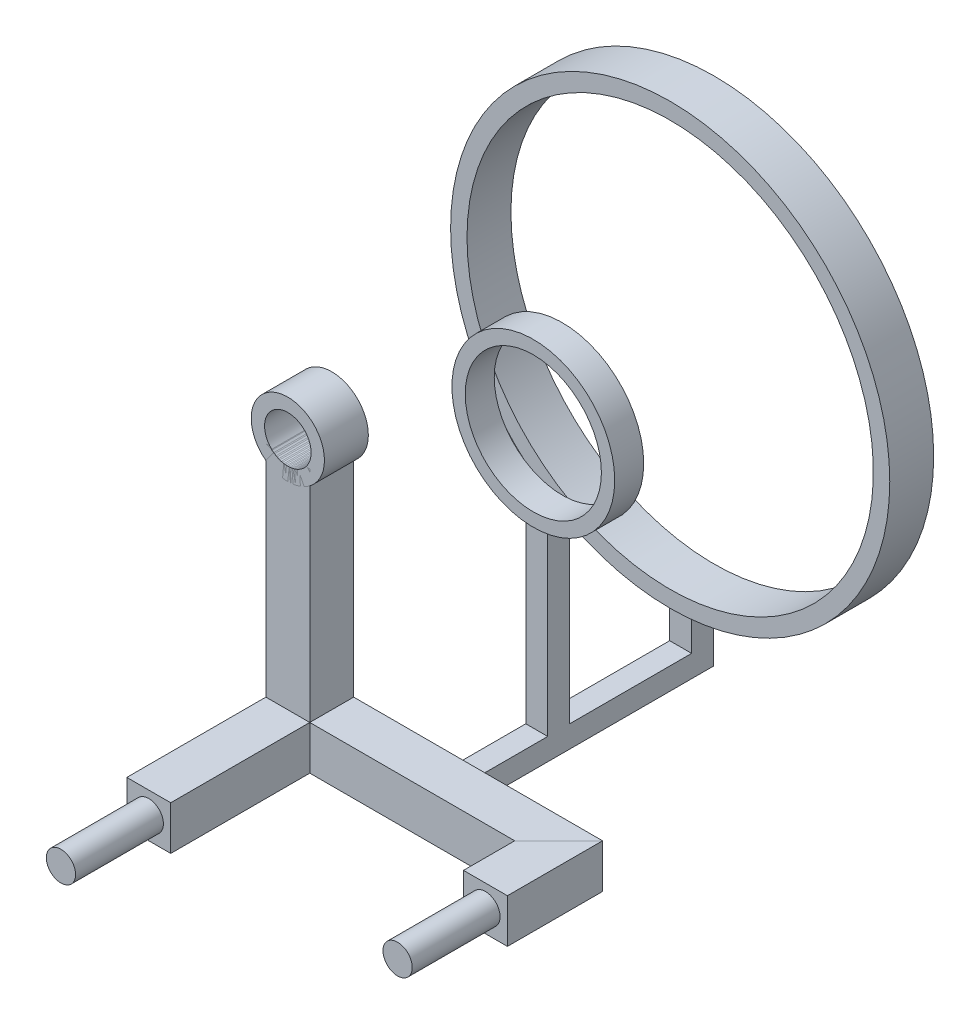
ISO-10303-21;
HEADER;
FILE_DESCRIPTION(('STEP AP214'),'2;1');
FILE_NAME('part.step','',(''),(''),'','','');
FILE_SCHEMA(('AUTOMOTIVE_DESIGN { 1 0 10303 214 1 1 1 1 }'));
ENDSEC;
DATA;
#1=APPLICATION_CONTEXT('core data for automotive mechanical design processes');
#2=APPLICATION_PROTOCOL_DEFINITION('international standard','automotive_design',2000,#1);
#3=PRODUCT_CONTEXT('',#1,'mechanical');
#4=PRODUCT('Part','Part','',(#3));
#5=PRODUCT_RELATED_PRODUCT_CATEGORY('part','',(#4));
#6=PRODUCT_DEFINITION_FORMATION('','',#4);
#7=PRODUCT_DEFINITION_CONTEXT('part definition',#1,'design');
#8=PRODUCT_DEFINITION('design','',#6,#7);
#9=PRODUCT_DEFINITION_SHAPE('','',#8);
#10=(LENGTH_UNIT() NAMED_UNIT(*) SI_UNIT(.MILLI.,.METRE.));
#11=(NAMED_UNIT(*) PLANE_ANGLE_UNIT() SI_UNIT($,.RADIAN.));
#12=(NAMED_UNIT(*) SI_UNIT($,.STERADIAN.) SOLID_ANGLE_UNIT());
#13=UNCERTAINTY_MEASURE_WITH_UNIT(LENGTH_MEASURE(1.E-05),#10,'distance_accuracy_value','');
#14=(GEOMETRIC_REPRESENTATION_CONTEXT(3) GLOBAL_UNCERTAINTY_ASSIGNED_CONTEXT((#13)) GLOBAL_UNIT_ASSIGNED_CONTEXT((#10,
#11,#12)) REPRESENTATION_CONTEXT('',''));
#15=CARTESIAN_POINT('',(0.,0.,0.));
#16=DIRECTION('',(0.,0.,1.));
#17=DIRECTION('',(1.,0.,0.));
#18=AXIS2_PLACEMENT_3D('',#15,#16,#17);
#19=CARTESIAN_POINT('',(8.95579673157945,0.,-19.8));
#20=DIRECTION('',(1.,0.,0.));
#21=DIRECTION('',(0.,0.,-1.));
#22=AXIS2_PLACEMENT_3D('',#19,#20,#21);
#23=PLANE('',#22);
#24=DIRECTION('',(0.,-1.,0.));
#25=VECTOR('',#24,1.);
#26=CARTESIAN_POINT('',(8.95579673157945,-1.5,-29.63));
#27=LINE('',#26,#25);
#28=CARTESIAN_POINT('',(8.95579673157945,2.69708856600093,-29.63));
#29=VERTEX_POINT('',#28);
#30=CARTESIAN_POINT('',(8.95579673157945,-1.5,-29.63));
#31=VERTEX_POINT('',#30);
#32=EDGE_CURVE('E139',#29,#31,#27,.T.);
#33=ORIENTED_EDGE('',*,*,#32,.F.);
#34=DIRECTION('',(0.,0.,1.));
#35=VECTOR('',#34,1.);
#36=CARTESIAN_POINT('',(8.95579673157945,2.69708856600093,-30.38));
#37=LINE('',#36,#35);
#38=CARTESIAN_POINT('',(8.95579673157945,2.69708856600093,-28.13));
#39=VERTEX_POINT('',#38);
#40=EDGE_CURVE('E137',#29,#39,#37,.T.);
#41=ORIENTED_EDGE('',*,*,#40,.T.);
#42=DIRECTION('',(0.,-1.,0.));
#43=VECTOR('',#42,1.);
#44=CARTESIAN_POINT('',(8.95579673157945,3.,-28.13));
#45=LINE('',#44,#43);
#46=CARTESIAN_POINT('',(8.95579673157945,0.,-28.13));
#47=VERTEX_POINT('',#46);
#48=EDGE_CURVE('E127',#39,#47,#45,.T.);
#49=ORIENTED_EDGE('',*,*,#48,.T.);
#50=DIRECTION('',(0.,0.,1.));
#51=VECTOR('',#50,1.);
#52=CARTESIAN_POINT('',(8.95579673157945,0.,-29.63));
#53=LINE('',#52,#51);
#54=CARTESIAN_POINT('',(8.95579673157945,0.,-19.8));
#55=VERTEX_POINT('',#54);
#56=EDGE_CURVE('E160',#47,#55,#53,.T.);
#57=ORIENTED_EDGE('',*,*,#56,.T.);
#58=DIRECTION('',(0.,1.,0.));
#59=VECTOR('',#58,1.);
#60=CARTESIAN_POINT('',(8.95579673157945,0.,-19.8));
#61=LINE('',#60,#59);
#62=CARTESIAN_POINT('',(8.95579673157945,12.1701638778981,-19.8));
#63=VERTEX_POINT('',#62);
#64=EDGE_CURVE('E194',#55,#63,#61,.T.);
#65=ORIENTED_EDGE('',*,*,#64,.T.);
#66=DIRECTION('',(0.,0.,-1.));
#67=VECTOR('',#66,1.);
#68=CARTESIAN_POINT('',(8.95579673157945,12.1701638778981,-18.06));
#69=LINE('',#68,#67);
#70=CARTESIAN_POINT('',(8.95579673157945,12.1701638778981,-18.3));
#71=VERTEX_POINT('',#70);
#72=EDGE_CURVE('E180',#63,#71,#69,.F.);
#73=ORIENTED_EDGE('',*,*,#72,.T.);
#74=DIRECTION('',(0.,-1.,0.));
#75=VECTOR('',#74,1.);
#76=CARTESIAN_POINT('',(8.95579673157945,17.68,-18.3));
#77=LINE('',#76,#75);
#78=CARTESIAN_POINT('',(8.95579673157945,0.,-18.3));
#79=VERTEX_POINT('',#78);
#80=EDGE_CURVE('E189',#71,#79,#77,.T.);
#81=ORIENTED_EDGE('',*,*,#80,.T.);
#82=DIRECTION('',(0.,0.,1.));
#83=VECTOR('',#82,1.);
#84=CARTESIAN_POINT('',(8.95579673157945,0.,-19.8));
#85=LINE('',#84,#83);
#86=CARTESIAN_POINT('',(8.95579673157945,0.,-11.75));
#87=VERTEX_POINT('',#86);
#88=EDGE_CURVE('E200',#79,#87,#85,.T.);
#89=ORIENTED_EDGE('',*,*,#88,.T.);
#90=DIRECTION('',(0.,1.,0.));
#91=VECTOR('',#90,1.);
#92=CARTESIAN_POINT('',(8.95579673157945,0.,-11.75));
#93=LINE('',#92,#91);
#94=CARTESIAN_POINT('',(8.95579673157945,-1.5,-11.75));
#95=VERTEX_POINT('',#94);
#96=EDGE_CURVE('E193',#95,#87,#93,.T.);
#97=ORIENTED_EDGE('',*,*,#96,.F.);
#98=DIRECTION('',(0.,0.,1.));
#99=VECTOR('',#98,1.);
#100=CARTESIAN_POINT('',(8.95579673157945,-1.5,-19.8));
#101=LINE('',#100,#99);
#102=EDGE_CURVE('E211',#31,#95,#101,.T.);
#103=ORIENTED_EDGE('',*,*,#102,.F.);
#104=EDGE_LOOP('',(#33,#41,#49,#57,#65,#73,#81,#89,#97,#103));
#105=FACE_BOUND('',#104,.T.);
#106=ADVANCED_FACE('F50',(#105),#23,.T.);
#107=CARTESIAN_POINT('',(7.45579673157945,0.,-19.8));
#108=DIRECTION('',(-1.,0.,0.));
#109=DIRECTION('',(0.,0.,1.));
#110=AXIS2_PLACEMENT_3D('',#107,#108,#109);
#111=PLANE('',#110);
#112=DIRECTION('',(0.,-1.,0.));
#113=VECTOR('',#112,1.);
#114=CARTESIAN_POINT('',(7.45579673157945,3.,-28.13));
#115=LINE('',#114,#113);
#116=CARTESIAN_POINT('',(7.45579673157945,2.70051318523233,-28.13));
#117=VERTEX_POINT('',#116);
#118=CARTESIAN_POINT('',(7.45579673157945,0.,-28.13));
#119=VERTEX_POINT('',#118);
#120=EDGE_CURVE('E134',#117,#119,#115,.T.);
#121=ORIENTED_EDGE('',*,*,#120,.F.);
#122=DIRECTION('',(0.,0.,1.));
#123=VECTOR('',#122,1.);
#124=CARTESIAN_POINT('',(7.45579673157945,2.70051318523233,-30.38));
#125=LINE('',#124,#123);
#126=CARTESIAN_POINT('',(7.45579673157945,2.70051318523233,-29.63));
#127=VERTEX_POINT('',#126);
#128=EDGE_CURVE('E64',#117,#127,#125,.F.);
#129=ORIENTED_EDGE('',*,*,#128,.T.);
#130=DIRECTION('',(0.,1.,0.));
#131=VECTOR('',#130,1.);
#132=CARTESIAN_POINT('',(7.45579673157945,-1.5,-29.63));
#133=LINE('',#132,#131);
#134=CARTESIAN_POINT('',(7.45579673157945,-1.5,-29.63));
#135=VERTEX_POINT('',#134);
#136=EDGE_CURVE('E158',#135,#127,#133,.T.);
#137=ORIENTED_EDGE('',*,*,#136,.F.);
#138=DIRECTION('',(0.,0.,1.));
#139=VECTOR('',#138,1.);
#140=CARTESIAN_POINT('',(7.45579673157945,-1.5,-19.8));
#141=LINE('',#140,#139);
#142=CARTESIAN_POINT('',(7.45579673157945,-1.5,-11.75));
#143=VERTEX_POINT('',#142);
#144=EDGE_CURVE('E213',#135,#143,#141,.T.);
#145=ORIENTED_EDGE('',*,*,#144,.T.);
#146=DIRECTION('',(0.,-1.,0.));
#147=VECTOR('',#146,1.);
#148=CARTESIAN_POINT('',(7.45579673157945,0.,-11.75));
#149=LINE('',#148,#147);
#150=CARTESIAN_POINT('',(7.45579673157945,0.,-11.75));
#151=VERTEX_POINT('',#150);
#152=EDGE_CURVE('E206',#151,#143,#149,.T.);
#153=ORIENTED_EDGE('',*,*,#152,.F.);
#154=DIRECTION('',(0.,0.,1.));
#155=VECTOR('',#154,1.);
#156=CARTESIAN_POINT('',(7.45579673157945,0.,-19.8));
#157=LINE('',#156,#155);
#158=CARTESIAN_POINT('',(7.45579673157945,0.,-18.3));
#159=VERTEX_POINT('',#158);
#160=EDGE_CURVE('E215',#159,#151,#157,.T.);
#161=ORIENTED_EDGE('',*,*,#160,.F.);
#162=DIRECTION('',(0.,-1.,0.));
#163=VECTOR('',#162,1.);
#164=CARTESIAN_POINT('',(7.45579673157945,17.68,-18.3));
#165=LINE('',#164,#163);
#166=CARTESIAN_POINT('',(7.45579673157945,12.1714726016647,-18.3));
#167=VERTEX_POINT('',#166);
#168=EDGE_CURVE('E191',#167,#159,#165,.T.);
#169=ORIENTED_EDGE('',*,*,#168,.F.);
#170=DIRECTION('',(0.,0.,-1.));
#171=VECTOR('',#170,1.);
#172=CARTESIAN_POINT('',(7.45579673157945,12.1714726016647,-18.06));
#173=LINE('',#172,#171);
#174=CARTESIAN_POINT('',(7.45579673157945,12.1714726016647,-19.8));
#175=VERTEX_POINT('',#174);
#176=EDGE_CURVE('E176',#167,#175,#173,.T.);
#177=ORIENTED_EDGE('',*,*,#176,.T.);
#178=DIRECTION('',(0.,-1.,0.));
#179=VECTOR('',#178,1.);
#180=CARTESIAN_POINT('',(7.45579673157945,0.,-19.8));
#181=LINE('',#180,#179);
#182=CARTESIAN_POINT('',(7.45579673157945,0.,-19.8));
#183=VERTEX_POINT('',#182);
#184=EDGE_CURVE('E196',#175,#183,#181,.T.);
#185=ORIENTED_EDGE('',*,*,#184,.T.);
#186=DIRECTION('',(0.,0.,1.));
#187=VECTOR('',#186,1.);
#188=CARTESIAN_POINT('',(7.45579673157945,0.,-29.63));
#189=LINE('',#188,#187);
#190=EDGE_CURVE('E164',#119,#183,#189,.T.);
#191=ORIENTED_EDGE('',*,*,#190,.F.);
#192=EDGE_LOOP('',(#121,#129,#137,#145,#153,#161,#169,#177,#185,#191));
#193=FACE_BOUND('',#192,.T.);
#194=ADVANCED_FACE('F227',(#193),#111,.T.);
#195=CARTESIAN_POINT('',(8.95579673157945,0.,-29.63));
#196=DIRECTION('',(0.,-1.,0.));
#197=DIRECTION('',(0.,0.,-1.));
#198=AXIS2_PLACEMENT_3D('',#195,#196,#197);
#199=PLANE('',#198);
#200=DIRECTION('',(1.,0.,0.));
#201=VECTOR('',#200,1.);
#202=CARTESIAN_POINT('',(7.45579673157945,0.,-28.13));
#203=LINE('',#202,#201);
#204=EDGE_CURVE('E131',#119,#47,#203,.T.);
#205=ORIENTED_EDGE('',*,*,#204,.F.);
#206=ORIENTED_EDGE('',*,*,#190,.T.);
#207=DIRECTION('',(1.,0.,0.));
#208=VECTOR('',#207,1.);
#209=CARTESIAN_POINT('',(8.95579673157945,0.,-19.8));
#210=LINE('',#209,#208);
#211=EDGE_CURVE('E153',#183,#55,#210,.T.);
#212=ORIENTED_EDGE('',*,*,#211,.T.);
#213=ORIENTED_EDGE('',*,*,#56,.F.);
#214=EDGE_LOOP('',(#205,#206,#212,#213));
#215=FACE_BOUND('',#214,.T.);
#216=ADVANCED_FACE('F242',(#215),#199,.F.);
#217=CARTESIAN_POINT('',(0.,0.,-19.8));
#218=DIRECTION('',(0.,0.,1.));
#219=DIRECTION('',(1.,0.,0.));
#220=AXIS2_PLACEMENT_3D('',#217,#218,#219);
#221=PLANE('',#220);
#222=ORIENTED_EDGE('',*,*,#211,.F.);
#223=ORIENTED_EDGE('',*,*,#184,.F.);
#224=CARTESIAN_POINT('',(8.21060339574557,17.6799993466058,-19.8));
#225=DIRECTION('',(0.,0.,1.));
#226=DIRECTION('',(1.,0.,0.));
#227=AXIS2_PLACEMENT_3D('',#224,#225,#226);
#228=CIRCLE('',#227,5.56);
#229=EDGE_CURVE('E183',#63,#175,#228,.F.);
#230=ORIENTED_EDGE('',*,*,#229,.F.);
#231=ORIENTED_EDGE('',*,*,#64,.F.);
#232=EDGE_LOOP('',(#222,#223,#230,#231));
#233=FACE_BOUND('',#232,.T.);
#234=ADVANCED_FACE('F239',(#233),#221,.F.);
#235=CARTESIAN_POINT('',(7.45579673157945,-1.5,-19.8));
#236=DIRECTION('',(0.,-1.,0.));
#237=DIRECTION('',(0.,0.,-1.));
#238=AXIS2_PLACEMENT_3D('',#235,#236,#237);
#239=PLANE('',#238);
#240=DIRECTION('',(1.,0.,0.));
#241=VECTOR('',#240,1.);
#242=CARTESIAN_POINT('',(7.45579673157945,-1.5,-11.75));
#243=LINE('',#242,#241);
#244=EDGE_CURVE('E197',#143,#95,#243,.T.);
#245=ORIENTED_EDGE('',*,*,#244,.F.);
#246=ORIENTED_EDGE('',*,*,#144,.F.);
#247=DIRECTION('',(-1.,0.,0.));
#248=VECTOR('',#247,1.);
#249=CARTESIAN_POINT('',(8.95579673157945,-1.5,-29.63));
#250=LINE('',#249,#248);
#251=EDGE_CURVE('E155',#31,#135,#250,.T.);
#252=ORIENTED_EDGE('',*,*,#251,.F.);
#253=ORIENTED_EDGE('',*,*,#102,.T.);
#254=EDGE_LOOP('',(#245,#246,#252,#253));
#255=FACE_BOUND('',#254,.T.);
#256=ADVANCED_FACE('F249',(#255),#239,.T.);
#257=CARTESIAN_POINT('',(7.45579673157945,0.,-19.8));
#258=DIRECTION('',(0.,1.,0.));
#259=DIRECTION('',(0.,0.,1.));
#260=AXIS2_PLACEMENT_3D('',#257,#258,#259);
#261=PLANE('',#260);
#262=DIRECTION('',(1.,0.,0.));
#263=VECTOR('',#262,1.);
#264=CARTESIAN_POINT('',(7.45579673157945,0.,-18.3));
#265=LINE('',#264,#263);
#266=EDGE_CURVE('E186',#159,#79,#265,.T.);
#267=ORIENTED_EDGE('',*,*,#266,.F.);
#268=ORIENTED_EDGE('',*,*,#160,.T.);
#269=DIRECTION('',(-1.,0.,0.));
#270=VECTOR('',#269,1.);
#271=CARTESIAN_POINT('',(7.45579673157945,0.,-11.75));
#272=LINE('',#271,#270);
#273=EDGE_CURVE('E203',#87,#151,#272,.T.);
#274=ORIENTED_EDGE('',*,*,#273,.F.);
#275=ORIENTED_EDGE('',*,*,#88,.F.);
#276=EDGE_LOOP('',(#267,#268,#274,#275));
#277=FACE_BOUND('',#276,.T.);
#278=ADVANCED_FACE('F232',(#277),#261,.T.);
#279=CARTESIAN_POINT('',(0.,0.,-11.75));
#280=DIRECTION('',(0.,0.,1.));
#281=DIRECTION('',(1.,0.,0.));
#282=AXIS2_PLACEMENT_3D('',#279,#280,#281);
#283=PLANE('',#282);
#284=ORIENTED_EDGE('',*,*,#96,.T.);
#285=ORIENTED_EDGE('',*,*,#273,.T.);
#286=ORIENTED_EDGE('',*,*,#152,.T.);
#287=ORIENTED_EDGE('',*,*,#244,.T.);
#288=EDGE_LOOP('',(#284,#285,#286,#287));
#289=FACE_BOUND('',#288,.T.);
#290=ADVANCED_FACE('F433',(#289),#283,.T.);
#291=CARTESIAN_POINT('',(7.45579673157945,17.68,-18.3));
#292=DIRECTION('',(0.,0.,-1.));
#293=DIRECTION('',(-1.,0.,0.));
#294=AXIS2_PLACEMENT_3D('',#291,#292,#293);
#295=PLANE('',#294);
#296=CARTESIAN_POINT('',(8.21060339574557,17.6799993466058,-18.3));
#297=DIRECTION('',(0.,0.,-1.));
#298=DIRECTION('',(-1.,0.,0.));
#299=AXIS2_PLACEMENT_3D('',#296,#297,#298);
#300=CIRCLE('',#299,5.56);
#301=EDGE_CURVE('E57',#167,#71,#300,.F.);
#302=ORIENTED_EDGE('',*,*,#301,.F.);
#303=ORIENTED_EDGE('',*,*,#168,.T.);
#304=ORIENTED_EDGE('',*,*,#266,.T.);
#305=ORIENTED_EDGE('',*,*,#80,.F.);
#306=EDGE_LOOP('',(#302,#303,#304,#305));
#307=FACE_BOUND('',#306,.T.);
#308=ADVANCED_FACE('F224',(#307),#295,.F.);
#309=CARTESIAN_POINT('',(8.21060339574557,17.6799993466058,-18.06));
#310=DIRECTION('',(0.,0.,-1.));
#311=DIRECTION('',(-1.,0.,0.));
#312=AXIS2_PLACEMENT_3D('',#309,#310,#311);
#313=CYLINDRICAL_SURFACE('',#312,5.56);
#314=CARTESIAN_POINT('',(8.21060339574557,17.6799993466058,-18.06));
#315=DIRECTION('',(0.,0.,1.));
#316=DIRECTION('',(1.,0.,0.));
#317=AXIS2_PLACEMENT_3D('',#314,#315,#316);
#318=CIRCLE('',#317,5.56);
#319=CARTESIAN_POINT('',(13.7706033957456,17.6799993466058,-18.06));
#320=VERTEX_POINT('',#319);
#321=EDGE_CURVE('E173',#320,#320,#318,.T.);
#322=ORIENTED_EDGE('',*,*,#321,.F.);
#323=EDGE_LOOP('',(#322));
#324=FACE_BOUND('',#323,.T.);
#325=CARTESIAN_POINT('',(8.21060339574557,17.6799993466058,-20.04));
#326=DIRECTION('',(0.,0.,1.));
#327=DIRECTION('',(1.,0.,0.));
#328=AXIS2_PLACEMENT_3D('',#325,#326,#327);
#329=CIRCLE('',#328,5.56);
#330=CARTESIAN_POINT('',(13.7706033957456,17.6799993466058,-20.04));
#331=VERTEX_POINT('',#330);
#332=EDGE_CURVE('E172',#331,#331,#329,.T.);
#333=ORIENTED_EDGE('',*,*,#332,.T.);
#334=EDGE_LOOP('',(#333));
#335=FACE_BOUND('',#334,.T.);
#336=ORIENTED_EDGE('',*,*,#72,.F.);
#337=ORIENTED_EDGE('',*,*,#229,.T.);
#338=ORIENTED_EDGE('',*,*,#176,.F.);
#339=ORIENTED_EDGE('',*,*,#301,.T.);
#340=EDGE_LOOP('',(#336,#337,#338,#339));
#341=FACE_BOUND('',#340,.T.);
#342=ADVANCED_FACE('F221',(#324,#335,#341),#313,.T.);
#343=CARTESIAN_POINT('',(8.21060339574557,17.6799993466058,-18.06));
#344=DIRECTION('',(0.,0.,1.));
#345=DIRECTION('',(1.,0.,0.));
#346=AXIS2_PLACEMENT_3D('',#343,#344,#345);
#347=PLANE('',#346);
#348=CARTESIAN_POINT('',(8.21060339574557,17.6799993466058,-18.06));
#349=DIRECTION('',(0.,0.,1.));
#350=DIRECTION('',(1.,0.,0.));
#351=AXIS2_PLACEMENT_3D('',#348,#349,#350);
#352=CIRCLE('',#351,4.65);
#353=CARTESIAN_POINT('',(12.8606033957456,17.6799993466058,-18.06));
#354=VERTEX_POINT('',#353);
#355=EDGE_CURVE('E169',#354,#354,#352,.T.);
#356=ORIENTED_EDGE('',*,*,#355,.F.);
#357=EDGE_LOOP('',(#356));
#358=FACE_BOUND('',#357,.T.);
#359=ORIENTED_EDGE('',*,*,#321,.T.);
#360=EDGE_LOOP('',(#359));
#361=FACE_BOUND('',#360,.T.);
#362=ADVANCED_FACE('F405',(#358,#361),#347,.T.);
#363=CARTESIAN_POINT('',(8.21060339574557,17.6799993466058,-20.04));
#364=DIRECTION('',(0.,0.,1.));
#365=DIRECTION('',(1.,0.,0.));
#366=AXIS2_PLACEMENT_3D('',#363,#364,#365);
#367=PLANE('',#366);
#368=CARTESIAN_POINT('',(8.21060339574557,17.6799993466058,-20.04));
#369=DIRECTION('',(0.,0.,-1.));
#370=DIRECTION('',(-1.,0.,0.));
#371=AXIS2_PLACEMENT_3D('',#368,#369,#370);
#372=CIRCLE('',#371,4.65);
#373=CARTESIAN_POINT('',(3.56060339574556,17.6799993466058,-20.04));
#374=VERTEX_POINT('',#373);
#375=EDGE_CURVE('E166',#374,#374,#372,.T.);
#376=ORIENTED_EDGE('',*,*,#375,.F.);
#377=EDGE_LOOP('',(#376));
#378=FACE_BOUND('',#377,.T.);
#379=ORIENTED_EDGE('',*,*,#332,.F.);
#380=EDGE_LOOP('',(#379));
#381=FACE_BOUND('',#380,.T.);
#382=ADVANCED_FACE('F397',(#378,#381),#367,.F.);
#383=CARTESIAN_POINT('',(8.21060339574557,17.6799993466058,-15.04));
#384=DIRECTION('',(0.,0.,-1.));
#385=DIRECTION('',(-1.,0.,0.));
#386=AXIS2_PLACEMENT_3D('',#383,#384,#385);
#387=CYLINDRICAL_SURFACE('',#386,4.65);
#388=ORIENTED_EDGE('',*,*,#355,.T.);
#389=EDGE_LOOP('',(#388));
#390=FACE_BOUND('',#389,.T.);
#391=ORIENTED_EDGE('',*,*,#375,.T.);
#392=EDGE_LOOP('',(#391));
#393=FACE_BOUND('',#392,.T.);
#394=ADVANCED_FACE('F272',(#390,#393),#387,.F.);
#395=CARTESIAN_POINT('',(0.,0.,-29.63));
#396=DIRECTION('',(0.,0.,1.));
#397=DIRECTION('',(1.,0.,0.));
#398=AXIS2_PLACEMENT_3D('',#395,#396,#397);
#399=PLANE('',#398);
#400=CARTESIAN_POINT('',(8.24,17.68,-29.63));
#401=DIRECTION('',(0.,0.,1.));
#402=DIRECTION('',(1.,0.,0.));
#403=AXIS2_PLACEMENT_3D('',#400,#401,#402);
#404=CIRCLE('',#403,15.);
#405=EDGE_CURVE('E71',#29,#127,#404,.F.);
#406=ORIENTED_EDGE('',*,*,#405,.F.);
#407=ORIENTED_EDGE('',*,*,#32,.T.);
#408=ORIENTED_EDGE('',*,*,#251,.T.);
#409=ORIENTED_EDGE('',*,*,#136,.T.);
#410=EDGE_LOOP('',(#406,#407,#408,#409));
#411=FACE_BOUND('',#410,.T.);
#412=ADVANCED_FACE('F267',(#411),#399,.F.);
#413=CARTESIAN_POINT('',(7.45579673157945,3.,-28.13));
#414=DIRECTION('',(0.,0.,-1.));
#415=DIRECTION('',(-1.,0.,0.));
#416=AXIS2_PLACEMENT_3D('',#413,#414,#415);
#417=PLANE('',#416);
#418=CARTESIAN_POINT('',(8.24,17.68,-28.13));
#419=DIRECTION('',(0.,0.,-1.));
#420=DIRECTION('',(-1.,0.,0.));
#421=AXIS2_PLACEMENT_3D('',#418,#419,#420);
#422=CIRCLE('',#421,15.);
#423=EDGE_CURVE('E12',#117,#39,#422,.F.);
#424=ORIENTED_EDGE('',*,*,#423,.F.);
#425=ORIENTED_EDGE('',*,*,#120,.T.);
#426=ORIENTED_EDGE('',*,*,#204,.T.);
#427=ORIENTED_EDGE('',*,*,#48,.F.);
#428=EDGE_LOOP('',(#424,#425,#426,#427));
#429=FACE_BOUND('',#428,.T.);
#430=ADVANCED_FACE('F129',(#429),#417,.F.);
#431=CARTESIAN_POINT('',(8.24,17.68,-30.38));
#432=DIRECTION('',(0.,0.,1.));
#433=DIRECTION('',(1.,0.,0.));
#434=AXIS2_PLACEMENT_3D('',#431,#432,#433);
#435=CYLINDRICAL_SURFACE('',#434,15.);
#436=CARTESIAN_POINT('',(8.24,17.68,-30.38));
#437=DIRECTION('',(0.,0.,-1.));
#438=DIRECTION('',(-1.,0.,0.));
#439=AXIS2_PLACEMENT_3D('',#436,#437,#438);
#440=CIRCLE('',#439,15.);
#441=CARTESIAN_POINT('',(-6.76,17.68,-30.38));
#442=VERTEX_POINT('',#441);
#443=EDGE_CURVE('E143',#442,#442,#440,.T.);
#444=ORIENTED_EDGE('',*,*,#443,.F.);
#445=EDGE_LOOP('',(#444));
#446=FACE_BOUND('',#445,.T.);
#447=CARTESIAN_POINT('',(8.24,17.68,-27.38));
#448=DIRECTION('',(0.,0.,-1.));
#449=DIRECTION('',(-1.,0.,0.));
#450=AXIS2_PLACEMENT_3D('',#447,#448,#449);
#451=CIRCLE('',#450,15.);
#452=CARTESIAN_POINT('',(-6.76,17.68,-27.38));
#453=VERTEX_POINT('',#452);
#454=EDGE_CURVE('E146',#453,#453,#451,.T.);
#455=ORIENTED_EDGE('',*,*,#454,.T.);
#456=EDGE_LOOP('',(#455));
#457=FACE_BOUND('',#456,.T.);
#458=ORIENTED_EDGE('',*,*,#40,.F.);
#459=ORIENTED_EDGE('',*,*,#405,.T.);
#460=ORIENTED_EDGE('',*,*,#128,.F.);
#461=ORIENTED_EDGE('',*,*,#423,.T.);
#462=EDGE_LOOP('',(#458,#459,#460,#461));
#463=FACE_BOUND('',#462,.T.);
#464=ADVANCED_FACE('F142',(#446,#457,#463),#435,.T.);
#465=CARTESIAN_POINT('',(8.24,17.68,-30.38));
#466=DIRECTION('',(0.,0.,-1.));
#467=DIRECTION('',(-1.,0.,0.));
#468=AXIS2_PLACEMENT_3D('',#465,#466,#467);
#469=PLANE('',#468);
#470=CARTESIAN_POINT('',(8.24,17.68,-30.38));
#471=DIRECTION('',(0.,0.,-1.));
#472=DIRECTION('',(-1.,0.,0.));
#473=AXIS2_PLACEMENT_3D('',#470,#471,#472);
#474=CIRCLE('',#473,13.88);
#475=CARTESIAN_POINT('',(-5.64,17.68,-30.38));
#476=VERTEX_POINT('',#475);
#477=EDGE_CURVE('E363',#476,#476,#474,.T.);
#478=ORIENTED_EDGE('',*,*,#477,.F.);
#479=EDGE_LOOP('',(#478));
#480=FACE_BOUND('',#479,.T.);
#481=ORIENTED_EDGE('',*,*,#443,.T.);
#482=EDGE_LOOP('',(#481));
#483=FACE_BOUND('',#482,.T.);
#484=ADVANCED_FACE('F292',(#480,#483),#469,.T.);
#485=CARTESIAN_POINT('',(8.24,17.68,-27.38));
#486=DIRECTION('',(0.,0.,-1.));
#487=DIRECTION('',(-1.,0.,0.));
#488=AXIS2_PLACEMENT_3D('',#485,#486,#487);
#489=PLANE('',#488);
#490=CARTESIAN_POINT('',(8.24,17.68,-27.38));
#491=DIRECTION('',(0.,0.,-1.));
#492=DIRECTION('',(-1.,0.,0.));
#493=AXIS2_PLACEMENT_3D('',#490,#491,#492);
#494=CIRCLE('',#493,13.88);
#495=CARTESIAN_POINT('',(-5.64,17.68,-27.38));
#496=VERTEX_POINT('',#495);
#497=EDGE_CURVE('E360',#496,#496,#494,.T.);
#498=ORIENTED_EDGE('',*,*,#497,.T.);
#499=EDGE_LOOP('',(#498));
#500=FACE_BOUND('',#499,.T.);
#501=ORIENTED_EDGE('',*,*,#454,.F.);
#502=EDGE_LOOP('',(#501));
#503=FACE_BOUND('',#502,.T.);
#504=ADVANCED_FACE('F304',(#500,#503),#489,.F.);
#505=CARTESIAN_POINT('',(8.24,17.68,-27.38));
#506=DIRECTION('',(0.,0.,-1.));
#507=DIRECTION('',(-1.,0.,0.));
#508=AXIS2_PLACEMENT_3D('',#505,#506,#507);
#509=CYLINDRICAL_SURFACE('',#508,13.88);
#510=ORIENTED_EDGE('',*,*,#497,.F.);
#511=EDGE_LOOP('',(#510));
#512=FACE_BOUND('',#511,.T.);
#513=ORIENTED_EDGE('',*,*,#477,.T.);
#514=EDGE_LOOP('',(#513));
#515=FACE_BOUND('',#514,.T.);
#516=ADVANCED_FACE('F315',(#512,#515),#509,.F.);
#517=CLOSED_SHELL('',(#106,#194,#216,#234,#256,#278,#290,#308,#342,#362,#382,#394,#412,#430,
#464,#484,#504,#516));
#518=MANIFOLD_SOLID_BREP('B2',#517);
#519=CARTESIAN_POINT('',(0.,17.5,-9.5));
#520=DIRECTION('',(0.,0.,-1.));
#521=DIRECTION('',(-1.,0.,0.));
#522=AXIS2_PLACEMENT_3D('',#519,#520,#521);
#523=CYLINDRICAL_SURFACE('',#522,2.5);
#524=CARTESIAN_POINT('',(0.,17.5,-9.5));
#525=DIRECTION('',(0.,0.,1.));
#526=DIRECTION('',(1.,0.,0.));
#527=AXIS2_PLACEMENT_3D('',#524,#525,#526);
#528=CIRCLE('',#527,2.5);
#529=CARTESIAN_POINT('',(2.5,17.5,-9.5));
#530=VERTEX_POINT('',#529);
#531=EDGE_CURVE('E49',#530,#530,#528,.T.);
#532=ORIENTED_EDGE('',*,*,#531,.F.);
#533=EDGE_LOOP('',(#532));
#534=FACE_BOUND('',#533,.T.);
#535=CARTESIAN_POINT('',(0.,17.5,-12.5));
#536=DIRECTION('',(0.,0.,1.));
#537=DIRECTION('',(1.,0.,0.));
#538=AXIS2_PLACEMENT_3D('',#535,#536,#537);
#539=CIRCLE('',#538,2.5);
#540=CARTESIAN_POINT('',(2.5,17.5,-12.5));
#541=VERTEX_POINT('',#540);
#542=EDGE_CURVE('E511',#541,#541,#539,.T.);
#543=ORIENTED_EDGE('',*,*,#542,.T.);
#544=EDGE_LOOP('',(#543));
#545=FACE_BOUND('',#544,.T.);
#546=ADVANCED_FACE('F504',(#534,#545),#523,.T.);
#547=CARTESIAN_POINT('',(0.,17.5,-9.5));
#548=DIRECTION('',(0.,0.,1.));
#549=DIRECTION('',(1.,0.,0.));
#550=AXIS2_PLACEMENT_3D('',#547,#548,#549);
#551=PLANE('',#550);
#552=CARTESIAN_POINT('',(0.,17.5,-9.5));
#553=DIRECTION('',(0.,0.,1.));
#554=DIRECTION('',(1.,0.,0.));
#555=AXIS2_PLACEMENT_3D('',#552,#553,#554);
#556=CIRCLE('',#555,1.59);
#557=CARTESIAN_POINT('',(1.59,17.5,-9.5));
#558=VERTEX_POINT('',#557);
#559=EDGE_CURVE('E516',#558,#558,#556,.T.);
#560=ORIENTED_EDGE('',*,*,#559,.F.);
#561=EDGE_LOOP('',(#560));
#562=FACE_BOUND('',#561,.T.);
#563=ORIENTED_EDGE('',*,*,#531,.T.);
#564=EDGE_LOOP('',(#563));
#565=FACE_BOUND('',#564,.T.);
#566=ADVANCED_FACE('F533',(#562,#565),#551,.T.);
#567=CARTESIAN_POINT('',(0.,17.5,-12.5));
#568=DIRECTION('',(0.,0.,1.));
#569=DIRECTION('',(1.,0.,0.));
#570=AXIS2_PLACEMENT_3D('',#567,#568,#569);
#571=PLANE('',#570);
#572=CARTESIAN_POINT('',(0.,17.5,-12.5));
#573=DIRECTION('',(0.,0.,1.));
#574=DIRECTION('',(1.,0.,0.));
#575=AXIS2_PLACEMENT_3D('',#572,#573,#574);
#576=CIRCLE('',#575,1.59);
#577=CARTESIAN_POINT('',(1.59,17.5,-12.5));
#578=VERTEX_POINT('',#577);
#579=EDGE_CURVE('E507',#578,#578,#576,.T.);
#580=ORIENTED_EDGE('',*,*,#579,.T.);
#581=EDGE_LOOP('',(#580));
#582=FACE_BOUND('',#581,.T.);
#583=ORIENTED_EDGE('',*,*,#542,.F.);
#584=EDGE_LOOP('',(#583));
#585=FACE_BOUND('',#584,.T.);
#586=ADVANCED_FACE('F524',(#582,#585),#571,.F.);
#587=CARTESIAN_POINT('',(0.,17.5,-7.5));
#588=DIRECTION('',(0.,0.,-1.));
#589=DIRECTION('',(-1.,0.,0.));
#590=AXIS2_PLACEMENT_3D('',#587,#588,#589);
#591=CYLINDRICAL_SURFACE('',#590,1.59);
#592=ORIENTED_EDGE('',*,*,#559,.T.);
#593=EDGE_LOOP('',(#592));
#594=FACE_BOUND('',#593,.T.);
#595=ORIENTED_EDGE('',*,*,#579,.F.);
#596=EDGE_LOOP('',(#595));
#597=FACE_BOUND('',#596,.T.);
#598=ADVANCED_FACE('F527',(#594,#597),#591,.F.);
#599=CLOSED_SHELL('',(#546,#566,#586,#598));
#600=MANIFOLD_SOLID_BREP('B6',#599);
#601=CARTESIAN_POINT('',(0.,16.5,0.));
#602=DIRECTION('',(0.,1.,0.));
#603=DIRECTION('',(0.,0.,1.));
#604=AXIS2_PLACEMENT_3D('',#601,#602,#603);
#605=PLANE('',#604);
#606=DIRECTION('',(0.,0.,-1.));
#607=VECTOR('',#606,1.);
#608=CARTESIAN_POINT('',(1.23616341961732,16.5,-7.5));
#609=LINE('',#608,#607);
#610=CARTESIAN_POINT('',(1.23616341961732,16.5,-9.5));
#611=VERTEX_POINT('',#610);
#612=CARTESIAN_POINT('',(1.23616341961732,16.5,-12.5));
#613=VERTEX_POINT('',#612);
#614=EDGE_CURVE('E502',#611,#613,#609,.T.);
#615=ORIENTED_EDGE('',*,*,#614,.F.);
#616=DIRECTION('',(1.,0.,0.));
#617=VECTOR('',#616,1.);
#618=CARTESIAN_POINT('',(-1.5,16.5,-9.5));
#619=LINE('',#618,#617);
#620=CARTESIAN_POINT('',(1.5,16.5,-9.5));
#621=VERTEX_POINT('',#620);
#622=EDGE_CURVE('E678',#611,#621,#619,.T.);
#623=ORIENTED_EDGE('',*,*,#622,.T.);
#624=DIRECTION('',(0.,0.,-1.));
#625=VECTOR('',#624,1.);
#626=CARTESIAN_POINT('',(1.5,16.5,-12.5));
#627=LINE('',#626,#625);
#628=CARTESIAN_POINT('',(1.5,16.5,-12.5));
#629=VERTEX_POINT('',#628);
#630=EDGE_CURVE('E816',#621,#629,#627,.T.);
#631=ORIENTED_EDGE('',*,*,#630,.T.);
#632=DIRECTION('',(-1.,0.,0.));
#633=VECTOR('',#632,1.);
#634=CARTESIAN_POINT('',(-1.5,16.5,-12.5));
#635=LINE('',#634,#633);
#636=EDGE_CURVE('E811',#629,#613,#635,.T.);
#637=ORIENTED_EDGE('',*,*,#636,.T.);
#638=EDGE_LOOP('',(#615,#623,#631,#637));
#639=FACE_BOUND('',#638,.T.);
#640=ADVANCED_FACE('F574',(#639),#605,.T.);
#641=CARTESIAN_POINT('',(-1.75,1.5,-12.5));
#642=DIRECTION('',(0.,-1.,0.));
#643=DIRECTION('',(0.,0.,-1.));
#644=AXIS2_PLACEMENT_3D('',#641,#642,#643);
#645=PLANE('',#644);
#646=DIRECTION('',(0.,0.,-1.));
#647=VECTOR('',#646,1.);
#648=CARTESIAN_POINT('',(1.5,1.5,-12.5));
#649=LINE('',#648,#647);
#650=CARTESIAN_POINT('',(1.5,1.5,-9.5));
#651=VERTEX_POINT('',#650);
#652=CARTESIAN_POINT('',(1.5,1.5,-12.5));
#653=VERTEX_POINT('',#652);
#654=EDGE_CURVE('E699',#651,#653,#649,.T.);
#655=ORIENTED_EDGE('',*,*,#654,.F.);
#656=DIRECTION('',(1.,0.,0.));
#657=VECTOR('',#656,1.);
#658=CARTESIAN_POINT('',(-1.75,1.5,-9.5));
#659=LINE('',#658,#657);
#660=CARTESIAN_POINT('',(15.5,1.5,-9.5));
#661=VERTEX_POINT('',#660);
#662=EDGE_CURVE('E744',#651,#661,#659,.T.);
#663=ORIENTED_EDGE('',*,*,#662,.T.);
#664=DIRECTION('',(-0.707106781186548,0.,0.707106781186548));
#665=VECTOR('',#664,1.);
#666=CARTESIAN_POINT('',(8.375,1.5,-2.375));
#667=LINE('',#666,#665);
#668=CARTESIAN_POINT('',(18.5,1.5,-12.5));
#669=VERTEX_POINT('',#668);
#670=EDGE_CURVE('E740',#669,#661,#667,.T.);
#671=ORIENTED_EDGE('',*,*,#670,.F.);
#672=DIRECTION('',(1.,0.,0.));
#673=VECTOR('',#672,1.);
#674=CARTESIAN_POINT('',(-1.75,1.5,-12.5));
#675=LINE('',#674,#673);
#676=EDGE_CURVE('E596',#653,#669,#675,.T.);
#677=ORIENTED_EDGE('',*,*,#676,.F.);
#678=EDGE_LOOP('',(#655,#663,#671,#677));
#679=FACE_BOUND('',#678,.T.);
#680=ADVANCED_FACE('F797',(#679),#645,.F.);
#681=CARTESIAN_POINT('',(-1.5,1.5,0.));
#682=DIRECTION('',(0.,-1.,0.));
#683=DIRECTION('',(0.,0.,-1.));
#684=AXIS2_PLACEMENT_3D('',#681,#682,#683);
#685=PLANE('',#684);
#686=DIRECTION('',(1.,0.,0.));
#687=VECTOR('',#686,1.);
#688=CARTESIAN_POINT('',(-1.5,1.5,-9.5));
#689=LINE('',#688,#687);
#690=CARTESIAN_POINT('',(-1.5,1.5,-9.5));
#691=VERTEX_POINT('',#690);
#692=EDGE_CURVE('E696',#691,#651,#689,.T.);
#693=ORIENTED_EDGE('',*,*,#692,.F.);
#694=DIRECTION('',(0.,0.,-1.));
#695=VECTOR('',#694,1.);
#696=CARTESIAN_POINT('',(-1.5,1.5,0.));
#697=LINE('',#696,#695);
#698=CARTESIAN_POINT('',(-1.5,1.5,0.));
#699=VERTEX_POINT('',#698);
#700=EDGE_CURVE('E718',#699,#691,#697,.T.);
#701=ORIENTED_EDGE('',*,*,#700,.F.);
#702=DIRECTION('',(-1.,0.,0.));
#703=VECTOR('',#702,1.);
#704=CARTESIAN_POINT('',(-1.5,1.5,0.));
#705=LINE('',#704,#703);
#706=CARTESIAN_POINT('',(1.5,1.5,0.));
#707=VERTEX_POINT('',#706);
#708=EDGE_CURVE('E721',#707,#699,#705,.T.);
#709=ORIENTED_EDGE('',*,*,#708,.F.);
#710=DIRECTION('',(0.,0.,-1.));
#711=VECTOR('',#710,1.);
#712=CARTESIAN_POINT('',(1.5,1.5,0.));
#713=LINE('',#712,#711);
#714=EDGE_CURVE('E727',#707,#651,#713,.T.);
#715=ORIENTED_EDGE('',*,*,#714,.T.);
#716=EDGE_LOOP('',(#693,#701,#709,#715));
#717=FACE_BOUND('',#716,.T.);
#718=ADVANCED_FACE('F834',(#717),#685,.F.);
#719=CARTESIAN_POINT('',(17.,0.,-6.));
#720=DIRECTION('',(0.,0.,-1.));
#721=DIRECTION('',(-1.,0.,0.));
#722=AXIS2_PLACEMENT_3D('',#719,#720,#721);
#723=PLANE('',#722);
#724=CARTESIAN_POINT('',(17.,0.,-5.99999999999999));
#725=DIRECTION('',(0.,0.,1.));
#726=DIRECTION('',(1.,0.,0.));
#727=AXIS2_PLACEMENT_3D('',#724,#725,#726);
#728=CIRCLE('',#727,1.);
#729=CARTESIAN_POINT('',(18.,0.,-5.99999999999999));
#730=VERTEX_POINT('',#729);
#731=EDGE_CURVE('E670',#730,#730,#728,.T.);
#732=ORIENTED_EDGE('',*,*,#731,.F.);
#733=EDGE_LOOP('',(#732));
#734=FACE_BOUND('',#733,.T.);
#735=DIRECTION('',(0.,1.,0.));
#736=VECTOR('',#735,1.);
#737=CARTESIAN_POINT('',(15.5,1.5,-6.));
#738=LINE('',#737,#736);
#739=CARTESIAN_POINT('',(15.5,-1.5,-6.));
#740=VERTEX_POINT('',#739);
#741=CARTESIAN_POINT('',(15.5,1.5,-6.));
#742=VERTEX_POINT('',#741);
#743=EDGE_CURVE('E758',#740,#742,#738,.T.);
#744=ORIENTED_EDGE('',*,*,#743,.F.);
#745=DIRECTION('',(-1.,0.,0.));
#746=VECTOR('',#745,1.);
#747=CARTESIAN_POINT('',(18.5,-1.5,-6.));
#748=LINE('',#747,#746);
#749=CARTESIAN_POINT('',(18.5,-1.5,-6.));
#750=VERTEX_POINT('',#749);
#751=EDGE_CURVE('E760',#750,#740,#748,.T.);
#752=ORIENTED_EDGE('',*,*,#751,.F.);
#753=DIRECTION('',(0.,-1.,0.));
#754=VECTOR('',#753,1.);
#755=CARTESIAN_POINT('',(18.5,1.5,-6.));
#756=LINE('',#755,#754);
#757=CARTESIAN_POINT('',(18.5,1.5,-6.));
#758=VERTEX_POINT('',#757);
#759=EDGE_CURVE('E762',#758,#750,#756,.T.);
#760=ORIENTED_EDGE('',*,*,#759,.F.);
#761=DIRECTION('',(1.,0.,0.));
#762=VECTOR('',#761,1.);
#763=CARTESIAN_POINT('',(18.5,1.5,-6.));
#764=LINE('',#763,#762);
#765=EDGE_CURVE('E701',#742,#758,#764,.T.);
#766=ORIENTED_EDGE('',*,*,#765,.F.);
#767=EDGE_LOOP('',(#744,#752,#760,#766));
#768=FACE_BOUND('',#767,.T.);
#769=ADVANCED_FACE('F576',(#734,#768),#723,.F.);
#770=CARTESIAN_POINT('',(0.,0.,0.));
#771=DIRECTION('',(0.,0.,1.));
#772=DIRECTION('',(1.,0.,0.));
#773=AXIS2_PLACEMENT_3D('',#770,#771,#772);
#774=PLANE('',#773);
#775=CARTESIAN_POINT('',(0.,0.,0.));
#776=DIRECTION('',(0.,0.,1.));
#777=DIRECTION('',(1.,0.,0.));
#778=AXIS2_PLACEMENT_3D('',#775,#776,#777);
#779=CIRCLE('',#778,1.);
#780=CARTESIAN_POINT('',(1.,0.,0.));
#781=VERTEX_POINT('',#780);
#782=EDGE_CURVE('E705',#781,#781,#779,.T.);
#783=ORIENTED_EDGE('',*,*,#782,.F.);
#784=EDGE_LOOP('',(#783));
#785=FACE_BOUND('',#784,.T.);
#786=DIRECTION('',(0.,1.,0.));
#787=VECTOR('',#786,1.);
#788=CARTESIAN_POINT('',(1.5,1.5,0.));
#789=LINE('',#788,#787);
#790=CARTESIAN_POINT('',(1.5,-1.5,0.));
#791=VERTEX_POINT('',#790);
#792=EDGE_CURVE('E724',#791,#707,#789,.T.);
#793=ORIENTED_EDGE('',*,*,#792,.T.);
#794=ORIENTED_EDGE('',*,*,#708,.T.);
#795=DIRECTION('',(0.,-1.,0.));
#796=VECTOR('',#795,1.);
#797=CARTESIAN_POINT('',(-1.5,1.5,0.));
#798=LINE('',#797,#796);
#799=CARTESIAN_POINT('',(-1.5,-1.5,0.));
#800=VERTEX_POINT('',#799);
#801=EDGE_CURVE('E709',#699,#800,#798,.T.);
#802=ORIENTED_EDGE('',*,*,#801,.T.);
#803=DIRECTION('',(1.,0.,0.));
#804=VECTOR('',#803,1.);
#805=CARTESIAN_POINT('',(-1.5,-1.5,0.));
#806=LINE('',#805,#804);
#807=EDGE_CURVE('E712',#800,#791,#806,.T.);
#808=ORIENTED_EDGE('',*,*,#807,.T.);
#809=EDGE_LOOP('',(#793,#794,#802,#808));
#810=FACE_BOUND('',#809,.T.);
#811=ADVANCED_FACE('F836',(#785,#810),#774,.T.);
#812=CARTESIAN_POINT('',(18.5,1.5,-12.75));
#813=DIRECTION('',(-1.,0.,0.));
#814=DIRECTION('',(0.,-1.,0.));
#815=AXIS2_PLACEMENT_3D('',#812,#813,#814);
#816=PLANE('',#815);
#817=DIRECTION('',(0.,1.,0.));
#818=VECTOR('',#817,1.);
#819=CARTESIAN_POINT('',(18.5,1.5,-12.5));
#820=LINE('',#819,#818);
#821=CARTESIAN_POINT('',(18.5,-1.5,-12.5));
#822=VERTEX_POINT('',#821);
#823=EDGE_CURVE('E743',#822,#669,#820,.T.);
#824=ORIENTED_EDGE('',*,*,#823,.T.);
#825=DIRECTION('',(0.,0.,1.));
#826=VECTOR('',#825,1.);
#827=CARTESIAN_POINT('',(18.5,1.5,-12.75));
#828=LINE('',#827,#826);
#829=EDGE_CURVE('E748',#669,#758,#828,.T.);
#830=ORIENTED_EDGE('',*,*,#829,.T.);
#831=ORIENTED_EDGE('',*,*,#759,.T.);
#832=DIRECTION('',(0.,0.,1.));
#833=VECTOR('',#832,1.);
#834=CARTESIAN_POINT('',(18.5,-1.5,-12.75));
#835=LINE('',#834,#833);
#836=EDGE_CURVE('E770',#822,#750,#835,.T.);
#837=ORIENTED_EDGE('',*,*,#836,.F.);
#838=EDGE_LOOP('',(#824,#830,#831,#837));
#839=FACE_BOUND('',#838,.T.);
#840=ADVANCED_FACE('F776',(#839),#816,.F.);
#841=CARTESIAN_POINT('',(18.5,-1.5,-12.75));
#842=DIRECTION('',(0.,1.,0.));
#843=DIRECTION('',(0.,0.,1.));
#844=AXIS2_PLACEMENT_3D('',#841,#842,#843);
#845=PLANE('',#844);
#846=DIRECTION('',(0.707106781186548,0.,-0.707106781186548));
#847=VECTOR('',#846,1.);
#848=CARTESIAN_POINT('',(8.375,-1.5,-2.375));
#849=LINE('',#848,#847);
#850=CARTESIAN_POINT('',(15.5,-1.5,-9.5));
#851=VERTEX_POINT('',#850);
#852=EDGE_CURVE('E713',#851,#822,#849,.T.);
#853=ORIENTED_EDGE('',*,*,#852,.T.);
#854=ORIENTED_EDGE('',*,*,#836,.T.);
#855=ORIENTED_EDGE('',*,*,#751,.T.);
#856=DIRECTION('',(0.,0.,1.));
#857=VECTOR('',#856,1.);
#858=CARTESIAN_POINT('',(15.5,-1.5,-12.75));
#859=LINE('',#858,#857);
#860=EDGE_CURVE('E767',#851,#740,#859,.T.);
#861=ORIENTED_EDGE('',*,*,#860,.F.);
#862=EDGE_LOOP('',(#853,#854,#855,#861));
#863=FACE_BOUND('',#862,.T.);
#864=ADVANCED_FACE('F788',(#863),#845,.F.);
#865=CARTESIAN_POINT('',(15.5,1.5,-12.75));
#866=DIRECTION('',(1.,0.,0.));
#867=DIRECTION('',(0.,1.,0.));
#868=AXIS2_PLACEMENT_3D('',#865,#866,#867);
#869=PLANE('',#868);
#870=DIRECTION('',(0.,-1.,0.));
#871=VECTOR('',#870,1.);
#872=CARTESIAN_POINT('',(15.5,1.5,-9.5));
#873=LINE('',#872,#871);
#874=EDGE_CURVE('E737',#661,#851,#873,.T.);
#875=ORIENTED_EDGE('',*,*,#874,.T.);
#876=ORIENTED_EDGE('',*,*,#860,.T.);
#877=ORIENTED_EDGE('',*,*,#743,.T.);
#878=DIRECTION('',(0.,0.,1.));
#879=VECTOR('',#878,1.);
#880=CARTESIAN_POINT('',(15.5,1.5,-12.75));
#881=LINE('',#880,#879);
#882=EDGE_CURVE('E764',#661,#742,#881,.T.);
#883=ORIENTED_EDGE('',*,*,#882,.F.);
#884=EDGE_LOOP('',(#875,#876,#877,#883));
#885=FACE_BOUND('',#884,.T.);
#886=ADVANCED_FACE('F884',(#885),#869,.F.);
#887=CARTESIAN_POINT('',(18.5,1.5,-12.75));
#888=DIRECTION('',(0.,-1.,0.));
#889=DIRECTION('',(0.,0.,-1.));
#890=AXIS2_PLACEMENT_3D('',#887,#888,#889);
#891=PLANE('',#890);
#892=ORIENTED_EDGE('',*,*,#670,.T.);
#893=ORIENTED_EDGE('',*,*,#882,.T.);
#894=ORIENTED_EDGE('',*,*,#765,.T.);
#895=ORIENTED_EDGE('',*,*,#829,.F.);
#896=EDGE_LOOP('',(#892,#893,#894,#895));
#897=FACE_BOUND('',#896,.T.);
#898=ADVANCED_FACE('F781',(#897),#891,.F.);
#899=CARTESIAN_POINT('',(-1.75,1.5,-9.5));
#900=DIRECTION('',(0.,0.,-1.));
#901=DIRECTION('',(0.,1.,0.));
#902=AXIS2_PLACEMENT_3D('',#899,#900,#901);
#903=PLANE('',#902);
#904=ORIENTED_EDGE('',*,*,#662,.F.);
#905=DIRECTION('',(0.,-1.,0.));
#906=VECTOR('',#905,1.);
#907=CARTESIAN_POINT('',(1.5,1.5,-9.5));
#908=LINE('',#907,#906);
#909=CARTESIAN_POINT('',(1.5,-1.5,-9.5));
#910=VERTEX_POINT('',#909);
#911=EDGE_CURVE('E706',#651,#910,#908,.T.);
#912=ORIENTED_EDGE('',*,*,#911,.T.);
#913=DIRECTION('',(1.,0.,0.));
#914=VECTOR('',#913,1.);
#915=CARTESIAN_POINT('',(-1.75,-1.5,-9.5));
#916=LINE('',#915,#914);
#917=EDGE_CURVE('E747',#910,#851,#916,.T.);
#918=ORIENTED_EDGE('',*,*,#917,.T.);
#919=ORIENTED_EDGE('',*,*,#874,.F.);
#920=EDGE_LOOP('',(#904,#912,#918,#919));
#921=FACE_BOUND('',#920,.T.);
#922=ADVANCED_FACE('F801',(#921),#903,.F.);
#923=CARTESIAN_POINT('',(-1.75,-1.5,-12.5));
#924=DIRECTION('',(0.,1.,0.));
#925=DIRECTION('',(0.,0.,1.));
#926=AXIS2_PLACEMENT_3D('',#923,#924,#925);
#927=PLANE('',#926);
#928=ORIENTED_EDGE('',*,*,#917,.F.);
#929=DIRECTION('',(-0.707106781186548,0.,-0.707106781186548));
#930=VECTOR('',#929,1.);
#931=CARTESIAN_POINT('',(4.75,-1.5,-6.25));
#932=LINE('',#931,#930);
#933=CARTESIAN_POINT('',(-1.5,-1.5,-12.5));
#934=VERTEX_POINT('',#933);
#935=EDGE_CURVE('E702',#910,#934,#932,.T.);
#936=ORIENTED_EDGE('',*,*,#935,.T.);
#937=DIRECTION('',(1.,0.,0.));
#938=VECTOR('',#937,1.);
#939=CARTESIAN_POINT('',(-1.75,-1.5,-12.5));
#940=LINE('',#939,#938);
#941=EDGE_CURVE('E751',#934,#822,#940,.T.);
#942=ORIENTED_EDGE('',*,*,#941,.T.);
#943=ORIENTED_EDGE('',*,*,#852,.F.);
#944=EDGE_LOOP('',(#928,#936,#942,#943));
#945=FACE_BOUND('',#944,.T.);
#946=ADVANCED_FACE('F792',(#945),#927,.F.);
#947=CARTESIAN_POINT('',(-1.75,1.5,-12.5));
#948=DIRECTION('',(0.,0.,1.));
#949=DIRECTION('',(0.,-1.,0.));
#950=AXIS2_PLACEMENT_3D('',#947,#948,#949);
#951=PLANE('',#950);
#952=CARTESIAN_POINT('',(-1.23616341961733,16.5,-12.5));
#953=VERTEX_POINT('',#952);
#954=CARTESIAN_POINT('',(-1.5,16.5,-12.5));
#955=VERTEX_POINT('',#954);
#956=EDGE_CURVE('E813',#953,#955,#635,.T.);
#957=ORIENTED_EDGE('',*,*,#956,.F.);
#958=CARTESIAN_POINT('',(0.,17.5,-12.5));
#959=DIRECTION('',(0.,0.,1.));
#960=DIRECTION('',(0.,-1.,0.));
#961=AXIS2_PLACEMENT_3D('',#958,#959,#960);
#962=CIRCLE('',#961,1.59);
#963=EDGE_CURVE('E588',#953,#613,#962,.T.);
#964=ORIENTED_EDGE('',*,*,#963,.T.);
#965=ORIENTED_EDGE('',*,*,#636,.F.);
#966=DIRECTION('',(0.,-1.,0.));
#967=VECTOR('',#966,1.);
#968=CARTESIAN_POINT('',(1.5,16.5,-12.5));
#969=LINE('',#968,#967);
#970=EDGE_CURVE('E693',#629,#653,#969,.T.);
#971=ORIENTED_EDGE('',*,*,#970,.T.);
#972=ORIENTED_EDGE('',*,*,#676,.T.);
#973=ORIENTED_EDGE('',*,*,#823,.F.);
#974=ORIENTED_EDGE('',*,*,#941,.F.);
#975=DIRECTION('',(0.,1.,0.));
#976=VECTOR('',#975,1.);
#977=CARTESIAN_POINT('',(-1.5,1.5,-12.5));
#978=LINE('',#977,#976);
#979=EDGE_CURVE('E708',#934,#955,#978,.T.);
#980=ORIENTED_EDGE('',*,*,#979,.T.);
#981=EDGE_LOOP('',(#957,#964,#965,#971,#972,#973,#974,#980));
#982=FACE_BOUND('',#981,.T.);
#983=ADVANCED_FACE('F795',(#982),#951,.F.);
#984=CARTESIAN_POINT('',(1.5,1.5,0.));
#985=DIRECTION('',(-1.,0.,0.));
#986=DIRECTION('',(0.,-1.,0.));
#987=AXIS2_PLACEMENT_3D('',#984,#985,#986);
#988=PLANE('',#987);
#989=ORIENTED_EDGE('',*,*,#714,.F.);
#990=ORIENTED_EDGE('',*,*,#792,.F.);
#991=DIRECTION('',(0.,0.,-1.));
#992=VECTOR('',#991,1.);
#993=CARTESIAN_POINT('',(1.5,-1.5,0.));
#994=LINE('',#993,#992);
#995=EDGE_CURVE('E717',#791,#910,#994,.T.);
#996=ORIENTED_EDGE('',*,*,#995,.T.);
#997=ORIENTED_EDGE('',*,*,#911,.F.);
#998=EDGE_LOOP('',(#989,#990,#996,#997));
#999=FACE_BOUND('',#998,.T.);
#1000=ADVANCED_FACE('F804',(#999),#988,.F.);
#1001=CARTESIAN_POINT('',(-1.5,-1.5,0.));
#1002=DIRECTION('',(0.,1.,0.));
#1003=DIRECTION('',(0.,0.,1.));
#1004=AXIS2_PLACEMENT_3D('',#1001,#1002,#1003);
#1005=PLANE('',#1004);
#1006=ORIENTED_EDGE('',*,*,#995,.F.);
#1007=ORIENTED_EDGE('',*,*,#807,.F.);
#1008=DIRECTION('',(0.,0.,-1.));
#1009=VECTOR('',#1008,1.);
#1010=CARTESIAN_POINT('',(-1.5,-1.5,0.));
#1011=LINE('',#1010,#1009);
#1012=EDGE_CURVE('E714',#800,#934,#1011,.T.);
#1013=ORIENTED_EDGE('',*,*,#1012,.T.);
#1014=ORIENTED_EDGE('',*,*,#935,.F.);
#1015=EDGE_LOOP('',(#1006,#1007,#1013,#1014));
#1016=FACE_BOUND('',#1015,.T.);
#1017=ADVANCED_FACE('F807',(#1016),#1005,.F.);
#1018=CARTESIAN_POINT('',(-1.5,1.5,0.));
#1019=DIRECTION('',(1.,0.,0.));
#1020=DIRECTION('',(0.,1.,0.));
#1021=AXIS2_PLACEMENT_3D('',#1018,#1019,#1020);
#1022=PLANE('',#1021);
#1023=ORIENTED_EDGE('',*,*,#700,.T.);
#1024=DIRECTION('',(0.,-1.,0.));
#1025=VECTOR('',#1024,1.);
#1026=CARTESIAN_POINT('',(-1.5,16.5,-9.5));
#1027=LINE('',#1026,#1025);
#1028=CARTESIAN_POINT('',(-1.5,16.5,-9.5));
#1029=VERTEX_POINT('',#1028);
#1030=EDGE_CURVE('E687',#1029,#691,#1027,.T.);
#1031=ORIENTED_EDGE('',*,*,#1030,.F.);
#1032=DIRECTION('',(0.,0.,1.));
#1033=VECTOR('',#1032,1.);
#1034=CARTESIAN_POINT('',(-1.5,16.5,-12.5));
#1035=LINE('',#1034,#1033);
#1036=EDGE_CURVE('E682',#955,#1029,#1035,.T.);
#1037=ORIENTED_EDGE('',*,*,#1036,.F.);
#1038=ORIENTED_EDGE('',*,*,#979,.F.);
#1039=ORIENTED_EDGE('',*,*,#1012,.F.);
#1040=ORIENTED_EDGE('',*,*,#801,.F.);
#1041=EDGE_LOOP('',(#1023,#1031,#1037,#1038,#1039,#1040));
#1042=FACE_BOUND('',#1041,.T.);
#1043=ADVANCED_FACE('F810',(#1042),#1022,.F.);
#1044=CARTESIAN_POINT('',(1.5,16.5,-12.5));
#1045=DIRECTION('',(-1.,0.,0.));
#1046=DIRECTION('',(0.,0.,1.));
#1047=AXIS2_PLACEMENT_3D('',#1044,#1045,#1046);
#1048=PLANE('',#1047);
#1049=DIRECTION('',(0.,-1.,0.));
#1050=VECTOR('',#1049,1.);
#1051=CARTESIAN_POINT('',(1.5,16.5,-9.5));
#1052=LINE('',#1051,#1050);
#1053=EDGE_CURVE('E684',#621,#651,#1052,.T.);
#1054=ORIENTED_EDGE('',*,*,#1053,.T.);
#1055=ORIENTED_EDGE('',*,*,#654,.T.);
#1056=ORIENTED_EDGE('',*,*,#970,.F.);
#1057=ORIENTED_EDGE('',*,*,#630,.F.);
#1058=EDGE_LOOP('',(#1054,#1055,#1056,#1057));
#1059=FACE_BOUND('',#1058,.T.);
#1060=ADVANCED_FACE('F831',(#1059),#1048,.F.);
#1061=CARTESIAN_POINT('',(-1.5,16.5,-9.5));
#1062=DIRECTION('',(0.,0.,-1.));
#1063=DIRECTION('',(-1.,0.,0.));
#1064=AXIS2_PLACEMENT_3D('',#1061,#1062,#1063);
#1065=PLANE('',#1064);
#1066=ORIENTED_EDGE('',*,*,#622,.F.);
#1067=CARTESIAN_POINT('',(0.,17.5,-9.5));
#1068=DIRECTION('',(0.,0.,-1.));
#1069=DIRECTION('',(-1.,0.,0.));
#1070=AXIS2_PLACEMENT_3D('',#1067,#1068,#1069);
#1071=CIRCLE('',#1070,1.59);
#1072=CARTESIAN_POINT('',(-1.23616341961733,16.5,-9.5));
#1073=VERTEX_POINT('',#1072);
#1074=EDGE_CURVE('E665',#611,#1073,#1071,.T.);
#1075=ORIENTED_EDGE('',*,*,#1074,.T.);
#1076=EDGE_CURVE('E676',#1029,#1073,#619,.T.);
#1077=ORIENTED_EDGE('',*,*,#1076,.F.);
#1078=ORIENTED_EDGE('',*,*,#1030,.T.);
#1079=ORIENTED_EDGE('',*,*,#692,.T.);
#1080=ORIENTED_EDGE('',*,*,#1053,.F.);
#1081=EDGE_LOOP('',(#1066,#1075,#1077,#1078,#1079,#1080));
#1082=FACE_BOUND('',#1081,.T.);
#1083=ADVANCED_FACE('F674',(#1082),#1065,.F.);
#1084=DIRECTION('',(0.,0.,-1.));
#1085=VECTOR('',#1084,1.);
#1086=CARTESIAN_POINT('',(-1.23616341961733,16.5,-7.5));
#1087=LINE('',#1086,#1085);
#1088=EDGE_CURVE('E582',#953,#1073,#1087,.F.);
#1089=ORIENTED_EDGE('',*,*,#1088,.F.);
#1090=ORIENTED_EDGE('',*,*,#956,.T.);
#1091=ORIENTED_EDGE('',*,*,#1036,.T.);
#1092=ORIENTED_EDGE('',*,*,#1076,.T.);
#1093=EDGE_LOOP('',(#1089,#1090,#1091,#1092));
#1094=FACE_BOUND('',#1093,.T.);
#1095=ADVANCED_FACE('F680',(#1094),#605,.T.);
#1096=CARTESIAN_POINT('',(0.,0.,6.));
#1097=DIRECTION('',(0.,0.,-1.));
#1098=DIRECTION('',(-1.,0.,0.));
#1099=AXIS2_PLACEMENT_3D('',#1096,#1097,#1098);
#1100=CYLINDRICAL_SURFACE('',#1099,1.);
#1101=CARTESIAN_POINT('',(0.,0.,6.));
#1102=DIRECTION('',(0.,0.,1.));
#1103=DIRECTION('',(1.,0.,0.));
#1104=AXIS2_PLACEMENT_3D('',#1101,#1102,#1103);
#1105=CIRCLE('',#1104,1.);
#1106=CARTESIAN_POINT('',(1.,0.,6.));
#1107=VERTEX_POINT('',#1106);
#1108=EDGE_CURVE('E819',#1107,#1107,#1105,.T.);
#1109=ORIENTED_EDGE('',*,*,#1108,.F.);
#1110=EDGE_LOOP('',(#1109));
#1111=FACE_BOUND('',#1110,.T.);
#1112=ORIENTED_EDGE('',*,*,#782,.T.);
#1113=EDGE_LOOP('',(#1112));
#1114=FACE_BOUND('',#1113,.T.);
#1115=ADVANCED_FACE('F856',(#1111,#1114),#1100,.T.);
#1116=CARTESIAN_POINT('',(0.,0.,6.));
#1117=DIRECTION('',(0.,0.,1.));
#1118=DIRECTION('',(1.,0.,0.));
#1119=AXIS2_PLACEMENT_3D('',#1116,#1117,#1118);
#1120=PLANE('',#1119);
#1121=ORIENTED_EDGE('',*,*,#1108,.T.);
#1122=EDGE_LOOP('',(#1121));
#1123=FACE_BOUND('',#1122,.T.);
#1124=ADVANCED_FACE('F861',(#1123),#1120,.T.);
#1125=CARTESIAN_POINT('',(17.,0.,0.));
#1126=DIRECTION('',(0.,0.,-1.));
#1127=DIRECTION('',(-1.,0.,0.));
#1128=AXIS2_PLACEMENT_3D('',#1125,#1126,#1127);
#1129=CYLINDRICAL_SURFACE('',#1128,1.);
#1130=CARTESIAN_POINT('',(17.,0.,0.));
#1131=DIRECTION('',(0.,0.,1.));
#1132=DIRECTION('',(1.,0.,0.));
#1133=AXIS2_PLACEMENT_3D('',#1130,#1131,#1132);
#1134=CIRCLE('',#1133,1.);
#1135=CARTESIAN_POINT('',(18.,0.,0.));
#1136=VERTEX_POINT('',#1135);
#1137=EDGE_CURVE('E824',#1136,#1136,#1134,.T.);
#1138=ORIENTED_EDGE('',*,*,#1137,.F.);
#1139=EDGE_LOOP('',(#1138));
#1140=FACE_BOUND('',#1139,.T.);
#1141=ORIENTED_EDGE('',*,*,#731,.T.);
#1142=EDGE_LOOP('',(#1141));
#1143=FACE_BOUND('',#1142,.T.);
#1144=ADVANCED_FACE('F948',(#1140,#1143),#1129,.T.);
#1145=CARTESIAN_POINT('',(17.,0.,0.));
#1146=DIRECTION('',(0.,0.,1.));
#1147=DIRECTION('',(1.,0.,0.));
#1148=AXIS2_PLACEMENT_3D('',#1145,#1146,#1147);
#1149=PLANE('',#1148);
#1150=ORIENTED_EDGE('',*,*,#1137,.T.);
#1151=EDGE_LOOP('',(#1150));
#1152=FACE_BOUND('',#1151,.T.);
#1153=ADVANCED_FACE('F965',(#1152),#1149,.T.);
#1154=CARTESIAN_POINT('',(0.,17.5,-7.5));
#1155=DIRECTION('',(0.,0.,-1.));
#1156=DIRECTION('',(-1.,0.,0.));
#1157=AXIS2_PLACEMENT_3D('',#1154,#1155,#1156);
#1158=CYLINDRICAL_SURFACE('',#1157,1.59);
#1159=ORIENTED_EDGE('',*,*,#614,.T.);
#1160=ORIENTED_EDGE('',*,*,#963,.F.);
#1161=ORIENTED_EDGE('',*,*,#1088,.T.);
#1162=ORIENTED_EDGE('',*,*,#1074,.F.);
#1163=EDGE_LOOP('',(#1159,#1160,#1161,#1162));
#1164=FACE_BOUND('',#1163,.T.);
#1165=ADVANCED_FACE('F664',(#1164),#1158,.F.);
#1166=CLOSED_SHELL('',(#640,#680,#718,#769,#811,#840,#864,#886,#898,#922,#946,#983,#1000,#1017,
#1043,#1060,#1083,#1095,#1115,#1124,#1144,#1153,#1165));
#1167=MANIFOLD_SOLID_BREP('B44',#1166);
#1168=ADVANCED_BREP_SHAPE_REPRESENTATION('',(#18,#518,#600,#1167),#14);
#1169=SHAPE_DEFINITION_REPRESENTATION(#9,#1168);
ENDSEC;
END-ISO-10303-21;
